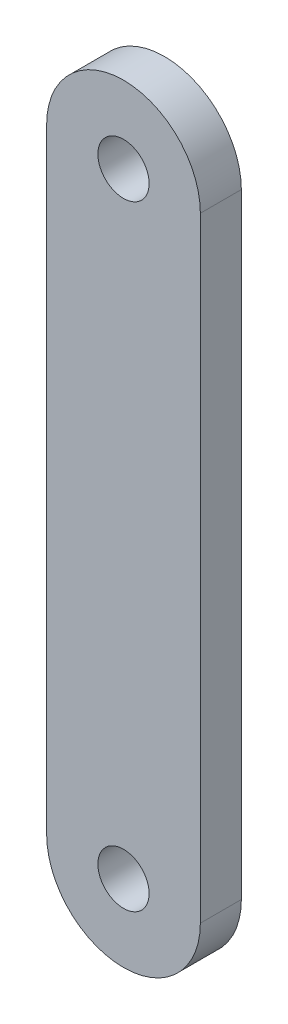
ISO-10303-21;
HEADER;
FILE_DESCRIPTION(('STEP AP214'),'2;1');
FILE_NAME('part.step','',(''),(''),'','','');
FILE_SCHEMA(('AUTOMOTIVE_DESIGN { 1 0 10303 214 1 1 1 1 }'));
ENDSEC;
DATA;
#1=APPLICATION_CONTEXT('core data for automotive mechanical design processes');
#2=APPLICATION_PROTOCOL_DEFINITION('international standard','automotive_design',2000,#1);
#3=PRODUCT_CONTEXT('',#1,'mechanical');
#4=PRODUCT('Part','Part','',(#3));
#5=PRODUCT_RELATED_PRODUCT_CATEGORY('part','',(#4));
#6=PRODUCT_DEFINITION_FORMATION('','',#4);
#7=PRODUCT_DEFINITION_CONTEXT('part definition',#1,'design');
#8=PRODUCT_DEFINITION('design','',#6,#7);
#9=PRODUCT_DEFINITION_SHAPE('','',#8);
#10=(LENGTH_UNIT() NAMED_UNIT(*) SI_UNIT(.MILLI.,.METRE.));
#11=(NAMED_UNIT(*) PLANE_ANGLE_UNIT() SI_UNIT($,.RADIAN.));
#12=(NAMED_UNIT(*) SI_UNIT($,.STERADIAN.) SOLID_ANGLE_UNIT());
#13=UNCERTAINTY_MEASURE_WITH_UNIT(LENGTH_MEASURE(1.E-05),#10,'distance_accuracy_value','');
#14=(GEOMETRIC_REPRESENTATION_CONTEXT(3) GLOBAL_UNCERTAINTY_ASSIGNED_CONTEXT((#13)) GLOBAL_UNIT_ASSIGNED_CONTEXT((#10,
#11,#12)) REPRESENTATION_CONTEXT('',''));
#15=CARTESIAN_POINT('',(0.,0.,0.));
#16=DIRECTION('',(0.,0.,1.));
#17=DIRECTION('',(1.,0.,0.));
#18=AXIS2_PLACEMENT_3D('',#15,#16,#17);
#19=CARTESIAN_POINT('',(0.,-19.05,2.54));
#20=DIRECTION('',(0.,0.,1.));
#21=DIRECTION('',(1.,0.,0.));
#22=AXIS2_PLACEMENT_3D('',#19,#20,#21);
#23=PLANE('',#22);
#24=CARTESIAN_POINT('',(0.,19.05,2.54));
#25=DIRECTION('',(0.,0.,1.));
#26=DIRECTION('',(1.,0.,0.));
#27=AXIS2_PLACEMENT_3D('',#24,#25,#26);
#28=CIRCLE('',#27,1.5875);
#29=CARTESIAN_POINT('',(1.58749999999999,19.05,2.54));
#30=VERTEX_POINT('',#29);
#31=EDGE_CURVE('E99',#30,#30,#28,.T.);
#32=ORIENTED_EDGE('',*,*,#31,.F.);
#33=EDGE_LOOP('',(#32));
#34=FACE_BOUND('',#33,.T.);
#35=CARTESIAN_POINT('',(0.,-19.05,2.54));
#36=DIRECTION('',(0.,0.,1.));
#37=DIRECTION('',(1.,0.,0.));
#38=AXIS2_PLACEMENT_3D('',#35,#36,#37);
#39=CIRCLE('',#38,4.76250000000001);
#40=CARTESIAN_POINT('',(-4.76250000000001,-19.05,2.54));
#41=VERTEX_POINT('',#40);
#42=CARTESIAN_POINT('',(4.76250000000001,-19.05,2.54));
#43=VERTEX_POINT('',#42);
#44=EDGE_CURVE('E84',#41,#43,#39,.T.);
#45=ORIENTED_EDGE('',*,*,#44,.T.);
#46=DIRECTION('',(0.,1.,0.));
#47=VECTOR('',#46,1.);
#48=CARTESIAN_POINT('',(4.76250000000001,-19.05,2.54));
#49=LINE('',#48,#47);
#50=CARTESIAN_POINT('',(4.7625,19.05,2.54));
#51=VERTEX_POINT('',#50);
#52=EDGE_CURVE('E79',#43,#51,#49,.T.);
#53=ORIENTED_EDGE('',*,*,#52,.T.);
#54=CARTESIAN_POINT('',(0.,19.05,2.54));
#55=DIRECTION('',(0.,0.,1.));
#56=DIRECTION('',(1.,0.,0.));
#57=AXIS2_PLACEMENT_3D('',#54,#55,#56);
#58=CIRCLE('',#57,4.76250000000001);
#59=CARTESIAN_POINT('',(-4.76250000000002,19.05,2.54));
#60=VERTEX_POINT('',#59);
#61=EDGE_CURVE('E82',#51,#60,#58,.T.);
#62=ORIENTED_EDGE('',*,*,#61,.T.);
#63=DIRECTION('',(0.,-1.,0.));
#64=VECTOR('',#63,1.);
#65=CARTESIAN_POINT('',(-4.76250000000001,-19.05,2.54));
#66=LINE('',#65,#64);
#67=EDGE_CURVE('E49',#60,#41,#66,.T.);
#68=ORIENTED_EDGE('',*,*,#67,.T.);
#69=EDGE_LOOP('',(#45,#53,#62,#68));
#70=FACE_BOUND('',#69,.T.);
#71=CARTESIAN_POINT('',(0.,-19.05,2.54));
#72=DIRECTION('',(0.,0.,1.));
#73=DIRECTION('',(1.,0.,0.));
#74=AXIS2_PLACEMENT_3D('',#71,#72,#73);
#75=CIRCLE('',#74,1.5875);
#76=CARTESIAN_POINT('',(1.5875,-19.05,2.54));
#77=VERTEX_POINT('',#76);
#78=EDGE_CURVE('E114',#77,#77,#75,.T.);
#79=ORIENTED_EDGE('',*,*,#78,.F.);
#80=EDGE_LOOP('',(#79));
#81=FACE_BOUND('',#80,.T.);
#82=ADVANCED_FACE('F32',(#34,#70,#81),#23,.T.);
#83=CARTESIAN_POINT('',(0.,-19.05,0.));
#84=DIRECTION('',(0.,0.,1.));
#85=DIRECTION('',(1.,0.,0.));
#86=AXIS2_PLACEMENT_3D('',#83,#84,#85);
#87=PLANE('',#86);
#88=CARTESIAN_POINT('',(0.,-19.05,0.));
#89=DIRECTION('',(0.,0.,1.));
#90=DIRECTION('',(1.,0.,0.));
#91=AXIS2_PLACEMENT_3D('',#88,#89,#90);
#92=CIRCLE('',#91,4.76250000000001);
#93=CARTESIAN_POINT('',(-4.76250000000001,-19.05,0.));
#94=VERTEX_POINT('',#93);
#95=CARTESIAN_POINT('',(4.76250000000001,-19.05,0.));
#96=VERTEX_POINT('',#95);
#97=EDGE_CURVE('E96',#94,#96,#92,.T.);
#98=ORIENTED_EDGE('',*,*,#97,.F.);
#99=DIRECTION('',(0.,-1.,0.));
#100=VECTOR('',#99,1.);
#101=CARTESIAN_POINT('',(-4.76250000000001,-19.05,0.));
#102=LINE('',#101,#100);
#103=CARTESIAN_POINT('',(-4.76250000000002,19.05,0.));
#104=VERTEX_POINT('',#103);
#105=EDGE_CURVE('E72',#104,#94,#102,.T.);
#106=ORIENTED_EDGE('',*,*,#105,.F.);
#107=CARTESIAN_POINT('',(0.,19.05,0.));
#108=DIRECTION('',(0.,0.,1.));
#109=DIRECTION('',(1.,0.,0.));
#110=AXIS2_PLACEMENT_3D('',#107,#108,#109);
#111=CIRCLE('',#110,4.76250000000001);
#112=CARTESIAN_POINT('',(4.7625,19.05,0.));
#113=VERTEX_POINT('',#112);
#114=EDGE_CURVE('E66',#113,#104,#111,.T.);
#115=ORIENTED_EDGE('',*,*,#114,.F.);
#116=DIRECTION('',(0.,1.,0.));
#117=VECTOR('',#116,1.);
#118=CARTESIAN_POINT('',(4.76250000000001,-19.05,0.));
#119=LINE('',#118,#117);
#120=EDGE_CURVE('E88',#96,#113,#119,.T.);
#121=ORIENTED_EDGE('',*,*,#120,.F.);
#122=EDGE_LOOP('',(#98,#106,#115,#121));
#123=FACE_BOUND('',#122,.T.);
#124=CARTESIAN_POINT('',(0.,19.05,0.));
#125=DIRECTION('',(0.,0.,1.));
#126=DIRECTION('',(1.,0.,0.));
#127=AXIS2_PLACEMENT_3D('',#124,#125,#126);
#128=CIRCLE('',#127,1.5875);
#129=CARTESIAN_POINT('',(1.58749999999999,19.05,0.));
#130=VERTEX_POINT('',#129);
#131=EDGE_CURVE('E111',#130,#130,#128,.T.);
#132=ORIENTED_EDGE('',*,*,#131,.T.);
#133=EDGE_LOOP('',(#132));
#134=FACE_BOUND('',#133,.T.);
#135=CARTESIAN_POINT('',(0.,-19.05,0.));
#136=DIRECTION('',(0.,0.,1.));
#137=DIRECTION('',(1.,0.,0.));
#138=AXIS2_PLACEMENT_3D('',#135,#136,#137);
#139=CIRCLE('',#138,1.5875);
#140=CARTESIAN_POINT('',(1.5875,-19.05,0.));
#141=VERTEX_POINT('',#140);
#142=EDGE_CURVE('E117',#141,#141,#139,.T.);
#143=ORIENTED_EDGE('',*,*,#142,.T.);
#144=EDGE_LOOP('',(#143));
#145=FACE_BOUND('',#144,.T.);
#146=ADVANCED_FACE('F107',(#123,#134,#145),#87,.F.);
#147=CARTESIAN_POINT('',(0.,-19.05,2.54));
#148=DIRECTION('',(0.,0.,-1.));
#149=DIRECTION('',(-1.,0.,0.));
#150=AXIS2_PLACEMENT_3D('',#147,#148,#149);
#151=CYLINDRICAL_SURFACE('',#150,4.76250000000001);
#152=ORIENTED_EDGE('',*,*,#97,.T.);
#153=DIRECTION('',(0.,0.,-1.));
#154=VECTOR('',#153,1.);
#155=CARTESIAN_POINT('',(4.76250000000001,-19.05,2.54));
#156=LINE('',#155,#154);
#157=EDGE_CURVE('E11',#43,#96,#156,.T.);
#158=ORIENTED_EDGE('',*,*,#157,.F.);
#159=ORIENTED_EDGE('',*,*,#44,.F.);
#160=DIRECTION('',(0.,0.,-1.));
#161=VECTOR('',#160,1.);
#162=CARTESIAN_POINT('',(-4.76250000000001,-19.05,2.54));
#163=LINE('',#162,#161);
#164=EDGE_CURVE('E92',#41,#94,#163,.T.);
#165=ORIENTED_EDGE('',*,*,#164,.T.);
#166=EDGE_LOOP('',(#152,#158,#159,#165));
#167=FACE_BOUND('',#166,.T.);
#168=ADVANCED_FACE('F34',(#167),#151,.T.);
#169=CARTESIAN_POINT('',(4.76250000000001,-19.05,2.54));
#170=DIRECTION('',(-1.,0.,0.));
#171=DIRECTION('',(0.,-1.,0.));
#172=AXIS2_PLACEMENT_3D('',#169,#170,#171);
#173=PLANE('',#172);
#174=ORIENTED_EDGE('',*,*,#120,.T.);
#175=DIRECTION('',(0.,0.,-1.));
#176=VECTOR('',#175,1.);
#177=CARTESIAN_POINT('',(4.7625,19.05,2.54));
#178=LINE('',#177,#176);
#179=EDGE_CURVE('E41',#51,#113,#178,.T.);
#180=ORIENTED_EDGE('',*,*,#179,.F.);
#181=ORIENTED_EDGE('',*,*,#52,.F.);
#182=ORIENTED_EDGE('',*,*,#157,.T.);
#183=EDGE_LOOP('',(#174,#180,#181,#182));
#184=FACE_BOUND('',#183,.T.);
#185=ADVANCED_FACE('F87',(#184),#173,.F.);
#186=CARTESIAN_POINT('',(0.,19.05,2.54));
#187=DIRECTION('',(0.,0.,-1.));
#188=DIRECTION('',(-1.,0.,0.));
#189=AXIS2_PLACEMENT_3D('',#186,#187,#188);
#190=CYLINDRICAL_SURFACE('',#189,4.76250000000001);
#191=ORIENTED_EDGE('',*,*,#114,.T.);
#192=DIRECTION('',(0.,0.,-1.));
#193=VECTOR('',#192,1.);
#194=CARTESIAN_POINT('',(-4.76250000000002,19.05,2.54));
#195=LINE('',#194,#193);
#196=EDGE_CURVE('E89',#60,#104,#195,.T.);
#197=ORIENTED_EDGE('',*,*,#196,.F.);
#198=ORIENTED_EDGE('',*,*,#61,.F.);
#199=ORIENTED_EDGE('',*,*,#179,.T.);
#200=EDGE_LOOP('',(#191,#197,#198,#199));
#201=FACE_BOUND('',#200,.T.);
#202=ADVANCED_FACE('F90',(#201),#190,.T.);
#203=CARTESIAN_POINT('',(-4.76250000000001,-19.05,2.54));
#204=DIRECTION('',(1.,0.,0.));
#205=DIRECTION('',(0.,1.,0.));
#206=AXIS2_PLACEMENT_3D('',#203,#204,#205);
#207=PLANE('',#206);
#208=ORIENTED_EDGE('',*,*,#105,.T.);
#209=ORIENTED_EDGE('',*,*,#164,.F.);
#210=ORIENTED_EDGE('',*,*,#67,.F.);
#211=ORIENTED_EDGE('',*,*,#196,.T.);
#212=EDGE_LOOP('',(#208,#209,#210,#211));
#213=FACE_BOUND('',#212,.T.);
#214=ADVANCED_FACE('F104',(#213),#207,.F.);
#215=CARTESIAN_POINT('',(0.,19.05,2.54));
#216=DIRECTION('',(0.,0.,-1.));
#217=DIRECTION('',(-1.,0.,0.));
#218=AXIS2_PLACEMENT_3D('',#215,#216,#217);
#219=CYLINDRICAL_SURFACE('',#218,1.5875);
#220=ORIENTED_EDGE('',*,*,#31,.T.);
#221=EDGE_LOOP('',(#220));
#222=FACE_BOUND('',#221,.T.);
#223=ORIENTED_EDGE('',*,*,#131,.F.);
#224=EDGE_LOOP('',(#223));
#225=FACE_BOUND('',#224,.T.);
#226=ADVANCED_FACE('F134',(#222,#225),#219,.F.);
#227=CARTESIAN_POINT('',(0.,-19.05,2.54));
#228=DIRECTION('',(0.,0.,-1.));
#229=DIRECTION('',(-1.,0.,0.));
#230=AXIS2_PLACEMENT_3D('',#227,#228,#229);
#231=CYLINDRICAL_SURFACE('',#230,1.5875);
#232=ORIENTED_EDGE('',*,*,#78,.T.);
#233=EDGE_LOOP('',(#232));
#234=FACE_BOUND('',#233,.T.);
#235=ORIENTED_EDGE('',*,*,#142,.F.);
#236=EDGE_LOOP('',(#235));
#237=FACE_BOUND('',#236,.T.);
#238=ADVANCED_FACE('F123',(#234,#237),#231,.F.);
#239=CLOSED_SHELL('',(#82,#146,#168,#185,#202,#214,#226,#238));
#240=MANIFOLD_SOLID_BREP('B2',#239);
#241=ADVANCED_BREP_SHAPE_REPRESENTATION('',(#18,#240),#14);
#242=SHAPE_DEFINITION_REPRESENTATION(#9,#241);
ENDSEC;
END-ISO-10303-21;
